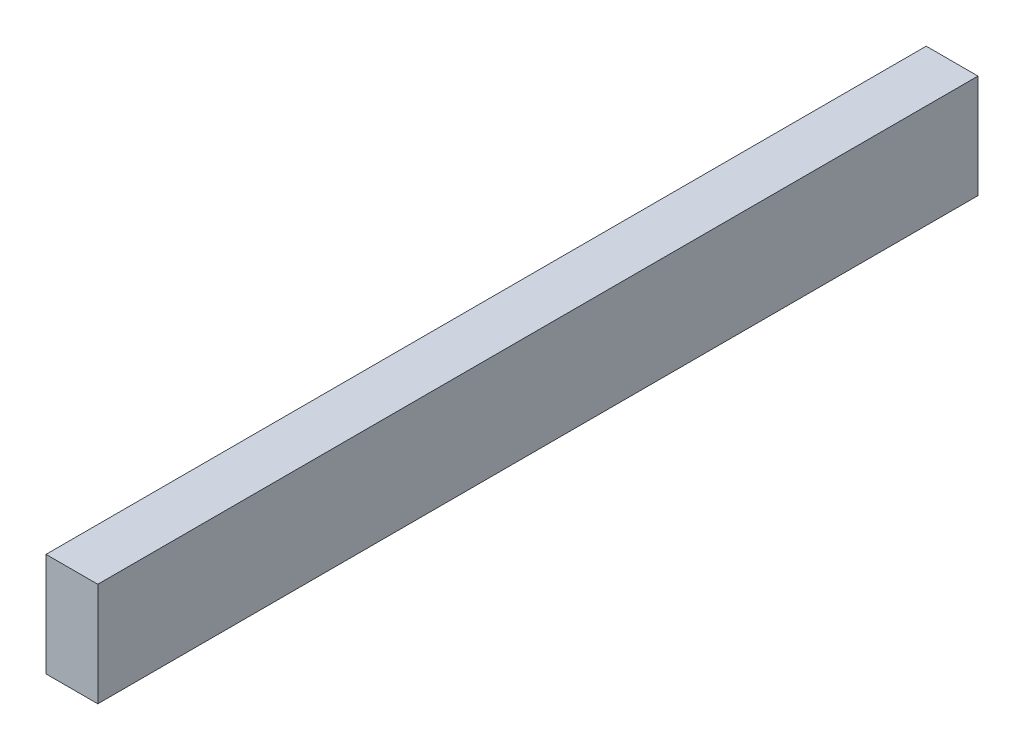
ISO-10303-21;
HEADER;
FILE_DESCRIPTION(('STEP AP214'),'2;1');
FILE_NAME('part.step','',(''),(''),'','','');
FILE_SCHEMA(('AUTOMOTIVE_DESIGN { 1 0 10303 214 1 1 1 1 }'));
ENDSEC;
DATA;
#1=APPLICATION_CONTEXT('core data for automotive mechanical design processes');
#2=APPLICATION_PROTOCOL_DEFINITION('international standard','automotive_design',2000,#1);
#3=PRODUCT_CONTEXT('',#1,'mechanical');
#4=PRODUCT('Part','Part','',(#3));
#5=PRODUCT_RELATED_PRODUCT_CATEGORY('part','',(#4));
#6=PRODUCT_DEFINITION_FORMATION('','',#4);
#7=PRODUCT_DEFINITION_CONTEXT('part definition',#1,'design');
#8=PRODUCT_DEFINITION('design','',#6,#7);
#9=PRODUCT_DEFINITION_SHAPE('','',#8);
#10=(LENGTH_UNIT() NAMED_UNIT(*) SI_UNIT(.MILLI.,.METRE.));
#11=(NAMED_UNIT(*) PLANE_ANGLE_UNIT() SI_UNIT($,.RADIAN.));
#12=(NAMED_UNIT(*) SI_UNIT($,.STERADIAN.) SOLID_ANGLE_UNIT());
#13=UNCERTAINTY_MEASURE_WITH_UNIT(LENGTH_MEASURE(1.E-05),#10,'distance_accuracy_value','');
#14=(GEOMETRIC_REPRESENTATION_CONTEXT(3) GLOBAL_UNCERTAINTY_ASSIGNED_CONTEXT((#13)) GLOBAL_UNIT_ASSIGNED_CONTEXT((#10,
#11,#12)) REPRESENTATION_CONTEXT('',''));
#15=CARTESIAN_POINT('',(0.,0.,0.));
#16=DIRECTION('',(0.,0.,1.));
#17=DIRECTION('',(1.,0.,0.));
#18=AXIS2_PLACEMENT_3D('',#15,#16,#17);
#19=CARTESIAN_POINT('',(25.4,-50.8,863.6));
#20=DIRECTION('',(-1.,0.,0.));
#21=DIRECTION('',(0.,0.,1.));
#22=AXIS2_PLACEMENT_3D('',#19,#20,#21);
#23=PLANE('',#22);
#24=DIRECTION('',(0.,1.,0.));
#25=VECTOR('',#24,1.);
#26=CARTESIAN_POINT('',(25.4,-50.8,0.));
#27=LINE('',#26,#25);
#28=CARTESIAN_POINT('',(25.4,-50.8,0.));
#29=VERTEX_POINT('',#28);
#30=CARTESIAN_POINT('',(25.4,50.8,0.));
#31=VERTEX_POINT('',#30);
#32=EDGE_CURVE('E96',#29,#31,#27,.T.);
#33=ORIENTED_EDGE('',*,*,#32,.T.);
#34=DIRECTION('',(0.,0.,-1.));
#35=VECTOR('',#34,1.);
#36=CARTESIAN_POINT('',(25.4,50.8,863.6));
#37=LINE('',#36,#35);
#38=CARTESIAN_POINT('',(25.4,50.8,863.6));
#39=VERTEX_POINT('',#38);
#40=EDGE_CURVE('E11',#39,#31,#37,.T.);
#41=ORIENTED_EDGE('',*,*,#40,.F.);
#42=DIRECTION('',(0.,1.,0.));
#43=VECTOR('',#42,1.);
#44=CARTESIAN_POINT('',(25.4,-50.8,863.6));
#45=LINE('',#44,#43);
#46=CARTESIAN_POINT('',(25.4,-50.8,863.6));
#47=VERTEX_POINT('',#46);
#48=EDGE_CURVE('E84',#47,#39,#45,.T.);
#49=ORIENTED_EDGE('',*,*,#48,.F.);
#50=DIRECTION('',(0.,0.,-1.));
#51=VECTOR('',#50,1.);
#52=CARTESIAN_POINT('',(25.4,-50.8,863.6));
#53=LINE('',#52,#51);
#54=EDGE_CURVE('E92',#47,#29,#53,.T.);
#55=ORIENTED_EDGE('',*,*,#54,.T.);
#56=EDGE_LOOP('',(#33,#41,#49,#55));
#57=FACE_BOUND('',#56,.T.);
#58=ADVANCED_FACE('F33',(#57),#23,.F.);
#59=CARTESIAN_POINT('',(-25.4,50.8,863.6));
#60=DIRECTION('',(0.,-1.,0.));
#61=DIRECTION('',(0.,0.,-1.));
#62=AXIS2_PLACEMENT_3D('',#59,#60,#61);
#63=PLANE('',#62);
#64=DIRECTION('',(-1.,0.,0.));
#65=VECTOR('',#64,1.);
#66=CARTESIAN_POINT('',(-25.4,50.8,0.));
#67=LINE('',#66,#65);
#68=CARTESIAN_POINT('',(-25.4,50.8,0.));
#69=VERTEX_POINT('',#68);
#70=EDGE_CURVE('E88',#31,#69,#67,.T.);
#71=ORIENTED_EDGE('',*,*,#70,.T.);
#72=DIRECTION('',(0.,0.,-1.));
#73=VECTOR('',#72,1.);
#74=CARTESIAN_POINT('',(-25.4,50.8,863.6));
#75=LINE('',#74,#73);
#76=CARTESIAN_POINT('',(-25.4,50.8,863.6));
#77=VERTEX_POINT('',#76);
#78=EDGE_CURVE('E41',#77,#69,#75,.T.);
#79=ORIENTED_EDGE('',*,*,#78,.F.);
#80=DIRECTION('',(-1.,0.,0.));
#81=VECTOR('',#80,1.);
#82=CARTESIAN_POINT('',(-25.4,50.8,863.6));
#83=LINE('',#82,#81);
#84=EDGE_CURVE('E79',#39,#77,#83,.T.);
#85=ORIENTED_EDGE('',*,*,#84,.F.);
#86=ORIENTED_EDGE('',*,*,#40,.T.);
#87=EDGE_LOOP('',(#71,#79,#85,#86));
#88=FACE_BOUND('',#87,.T.);
#89=ADVANCED_FACE('F87',(#88),#63,.F.);
#90=CARTESIAN_POINT('',(-25.4,-50.8,863.6));
#91=DIRECTION('',(1.,0.,0.));
#92=DIRECTION('',(0.,0.,-1.));
#93=AXIS2_PLACEMENT_3D('',#90,#91,#92);
#94=PLANE('',#93);
#95=DIRECTION('',(0.,-1.,0.));
#96=VECTOR('',#95,1.);
#97=CARTESIAN_POINT('',(-25.4,-50.8,0.));
#98=LINE('',#97,#96);
#99=CARTESIAN_POINT('',(-25.4,-50.8,0.));
#100=VERTEX_POINT('',#99);
#101=EDGE_CURVE('E66',#69,#100,#98,.T.);
#102=ORIENTED_EDGE('',*,*,#101,.T.);
#103=DIRECTION('',(0.,0.,-1.));
#104=VECTOR('',#103,1.);
#105=CARTESIAN_POINT('',(-25.4,-50.8,863.6));
#106=LINE('',#105,#104);
#107=CARTESIAN_POINT('',(-25.4,-50.8,863.6));
#108=VERTEX_POINT('',#107);
#109=EDGE_CURVE('E89',#108,#100,#106,.T.);
#110=ORIENTED_EDGE('',*,*,#109,.F.);
#111=DIRECTION('',(0.,-1.,0.));
#112=VECTOR('',#111,1.);
#113=CARTESIAN_POINT('',(-25.4,-50.8,863.6));
#114=LINE('',#113,#112);
#115=EDGE_CURVE('E82',#77,#108,#114,.T.);
#116=ORIENTED_EDGE('',*,*,#115,.F.);
#117=ORIENTED_EDGE('',*,*,#78,.T.);
#118=EDGE_LOOP('',(#102,#110,#116,#117));
#119=FACE_BOUND('',#118,.T.);
#120=ADVANCED_FACE('F90',(#119),#94,.F.);
#121=CARTESIAN_POINT('',(-25.4,-50.8,863.6));
#122=DIRECTION('',(0.,1.,0.));
#123=DIRECTION('',(0.,0.,1.));
#124=AXIS2_PLACEMENT_3D('',#121,#122,#123);
#125=PLANE('',#124);
#126=DIRECTION('',(1.,0.,0.));
#127=VECTOR('',#126,1.);
#128=CARTESIAN_POINT('',(-25.4,-50.8,0.));
#129=LINE('',#128,#127);
#130=EDGE_CURVE('E72',#100,#29,#129,.T.);
#131=ORIENTED_EDGE('',*,*,#130,.T.);
#132=ORIENTED_EDGE('',*,*,#54,.F.);
#133=DIRECTION('',(1.,0.,0.));
#134=VECTOR('',#133,1.);
#135=CARTESIAN_POINT('',(-25.4,-50.8,863.6));
#136=LINE('',#135,#134);
#137=EDGE_CURVE('E49',#108,#47,#136,.T.);
#138=ORIENTED_EDGE('',*,*,#137,.F.);
#139=ORIENTED_EDGE('',*,*,#109,.T.);
#140=EDGE_LOOP('',(#131,#132,#138,#139));
#141=FACE_BOUND('',#140,.T.);
#142=ADVANCED_FACE('F103',(#141),#125,.F.);
#143=CARTESIAN_POINT('',(0.,0.,863.6));
#144=DIRECTION('',(0.,0.,-1.));
#145=DIRECTION('',(-1.,0.,0.));
#146=AXIS2_PLACEMENT_3D('',#143,#144,#145);
#147=PLANE('',#146);
#148=ORIENTED_EDGE('',*,*,#48,.T.);
#149=ORIENTED_EDGE('',*,*,#84,.T.);
#150=ORIENTED_EDGE('',*,*,#115,.T.);
#151=ORIENTED_EDGE('',*,*,#137,.T.);
#152=EDGE_LOOP('',(#148,#149,#150,#151));
#153=FACE_BOUND('',#152,.T.);
#154=ADVANCED_FACE('F80',(#153),#147,.F.);
#155=CARTESIAN_POINT('',(0.,0.,0.));
#156=DIRECTION('',(0.,0.,-1.));
#157=DIRECTION('',(-1.,0.,0.));
#158=AXIS2_PLACEMENT_3D('',#155,#156,#157);
#159=PLANE('',#158);
#160=ORIENTED_EDGE('',*,*,#32,.F.);
#161=ORIENTED_EDGE('',*,*,#130,.F.);
#162=ORIENTED_EDGE('',*,*,#101,.F.);
#163=ORIENTED_EDGE('',*,*,#70,.F.);
#164=EDGE_LOOP('',(#160,#161,#162,#163));
#165=FACE_BOUND('',#164,.T.);
#166=ADVANCED_FACE('F106',(#165),#159,.T.);
#167=CLOSED_SHELL('',(#58,#89,#120,#142,#154,#166));
#168=MANIFOLD_SOLID_BREP('B2',#167);
#169=ADVANCED_BREP_SHAPE_REPRESENTATION('',(#18,#168),#14);
#170=SHAPE_DEFINITION_REPRESENTATION(#9,#169);
ENDSEC;
END-ISO-10303-21;
